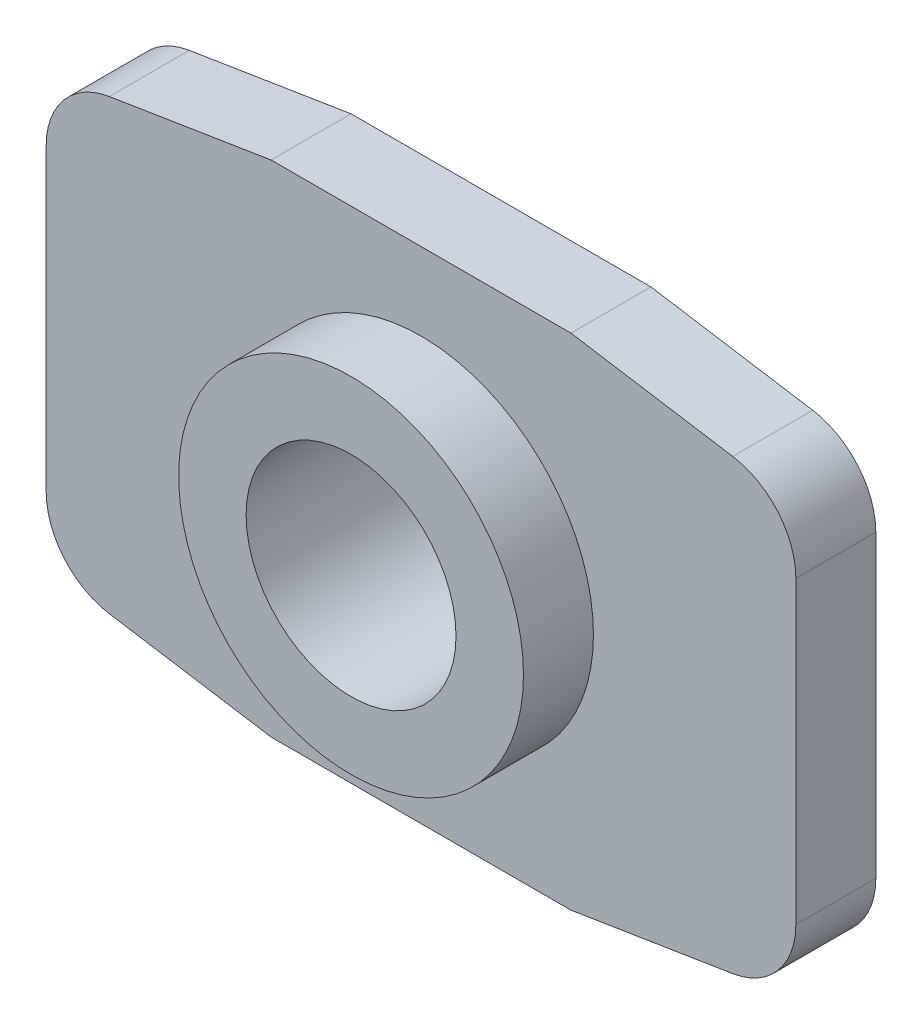
ISO-10303-21;
HEADER;
FILE_DESCRIPTION(('STEP AP214'),'2;1');
FILE_NAME('part.step','',(''),(''),'','','');
FILE_SCHEMA(('AUTOMOTIVE_DESIGN { 1 0 10303 214 1 1 1 1 }'));
ENDSEC;
DATA;
#1=APPLICATION_CONTEXT('core data for automotive mechanical design processes');
#2=APPLICATION_PROTOCOL_DEFINITION('international standard','automotive_design',2000,#1);
#3=PRODUCT_CONTEXT('',#1,'mechanical');
#4=PRODUCT('Part','Part','',(#3));
#5=PRODUCT_RELATED_PRODUCT_CATEGORY('part','',(#4));
#6=PRODUCT_DEFINITION_FORMATION('','',#4);
#7=PRODUCT_DEFINITION_CONTEXT('part definition',#1,'design');
#8=PRODUCT_DEFINITION('design','',#6,#7);
#9=PRODUCT_DEFINITION_SHAPE('','',#8);
#10=(LENGTH_UNIT() NAMED_UNIT(*) SI_UNIT(.MILLI.,.METRE.));
#11=(NAMED_UNIT(*) PLANE_ANGLE_UNIT() SI_UNIT($,.RADIAN.));
#12=(NAMED_UNIT(*) SI_UNIT($,.STERADIAN.) SOLID_ANGLE_UNIT());
#13=UNCERTAINTY_MEASURE_WITH_UNIT(LENGTH_MEASURE(1.E-05),#10,'distance_accuracy_value','');
#14=(GEOMETRIC_REPRESENTATION_CONTEXT(3) GLOBAL_UNCERTAINTY_ASSIGNED_CONTEXT((#13)) GLOBAL_UNIT_ASSIGNED_CONTEXT((#10,
#11,#12)) REPRESENTATION_CONTEXT('',''));
#15=CARTESIAN_POINT('',(0.,0.,0.));
#16=DIRECTION('',(0.,0.,1.));
#17=DIRECTION('',(1.,0.,0.));
#18=AXIS2_PLACEMENT_3D('',#15,#16,#17);
#19=CARTESIAN_POINT('',(5.99999999999999,3.,1.6));
#20=DIRECTION('',(0.,0.,-1.));
#21=DIRECTION('',(-1.,0.,0.));
#22=AXIS2_PLACEMENT_3D('',#19,#20,#21);
#23=CYLINDRICAL_SURFACE('',#22,1.5);
#24=CARTESIAN_POINT('',(5.99999999999999,3.,0.));
#25=DIRECTION('',(0.,0.,1.));
#26=DIRECTION('',(1.,0.,0.));
#27=AXIS2_PLACEMENT_3D('',#24,#25,#26);
#28=CIRCLE('',#27,1.5);
#29=CARTESIAN_POINT('',(7.49999999999999,3.,0.));
#30=VERTEX_POINT('',#29);
#31=CARTESIAN_POINT('',(6.23739675280407,4.48109512920612,0.));
#32=VERTEX_POINT('',#31);
#33=EDGE_CURVE('E179',#30,#32,#28,.T.);
#34=ORIENTED_EDGE('',*,*,#33,.T.);
#35=DIRECTION('',(0.,0.,-1.));
#36=VECTOR('',#35,1.);
#37=CARTESIAN_POINT('',(6.23739675280407,4.48109512920612,1.6));
#38=LINE('',#37,#36);
#39=CARTESIAN_POINT('',(6.23739675280407,4.48109512920612,1.6));
#40=VERTEX_POINT('',#39);
#41=EDGE_CURVE('E54',#40,#32,#38,.T.);
#42=ORIENTED_EDGE('',*,*,#41,.F.);
#43=CARTESIAN_POINT('',(5.99999999999999,3.,1.6));
#44=DIRECTION('',(0.,0.,1.));
#45=DIRECTION('',(1.,0.,0.));
#46=AXIS2_PLACEMENT_3D('',#43,#44,#45);
#47=CIRCLE('',#46,1.5);
#48=CARTESIAN_POINT('',(7.49999999999999,3.,1.6));
#49=VERTEX_POINT('',#48);
#50=EDGE_CURVE('E214',#49,#40,#47,.T.);
#51=ORIENTED_EDGE('',*,*,#50,.F.);
#52=DIRECTION('',(0.,0.,-1.));
#53=VECTOR('',#52,1.);
#54=CARTESIAN_POINT('',(7.49999999999999,3.,1.6));
#55=LINE('',#54,#53);
#56=EDGE_CURVE('E175',#49,#30,#55,.T.);
#57=ORIENTED_EDGE('',*,*,#56,.T.);
#58=EDGE_LOOP('',(#34,#42,#51,#57));
#59=FACE_BOUND('',#58,.T.);
#60=ADVANCED_FACE('F51',(#59),#23,.T.);
#61=CARTESIAN_POINT('',(6.23739675280407,4.48109512920612,1.6));
#62=DIRECTION('',(-0.158264501869385,-0.987396752804077,0.));
#63=DIRECTION('',(0.987396752804077,-0.158264501869385,0.));
#64=AXIS2_PLACEMENT_3D('',#61,#62,#63);
#65=PLANE('',#64);
#66=DIRECTION('',(-0.987396752804077,0.158264501869385,0.));
#67=VECTOR('',#66,1.);
#68=CARTESIAN_POINT('',(6.23739675280407,4.48109512920612,0.));
#69=LINE('',#68,#67);
#70=CARTESIAN_POINT('',(3.00000000000001,5.,0.));
#71=VERTEX_POINT('',#70);
#72=EDGE_CURVE('E183',#32,#71,#69,.T.);
#73=ORIENTED_EDGE('',*,*,#72,.T.);
#74=DIRECTION('',(0.,0.,-1.));
#75=VECTOR('',#74,1.);
#76=CARTESIAN_POINT('',(3.00000000000001,5.,1.6));
#77=LINE('',#76,#75);
#78=CARTESIAN_POINT('',(3.00000000000001,5.,1.6));
#79=VERTEX_POINT('',#78);
#80=EDGE_CURVE('E244',#79,#71,#77,.T.);
#81=ORIENTED_EDGE('',*,*,#80,.F.);
#82=DIRECTION('',(-0.987396752804077,0.158264501869385,0.));
#83=VECTOR('',#82,1.);
#84=CARTESIAN_POINT('',(6.23739675280407,4.48109512920612,1.6));
#85=LINE('',#84,#83);
#86=EDGE_CURVE('E125',#40,#79,#85,.T.);
#87=ORIENTED_EDGE('',*,*,#86,.F.);
#88=ORIENTED_EDGE('',*,*,#41,.T.);
#89=EDGE_LOOP('',(#73,#81,#87,#88));
#90=FACE_BOUND('',#89,.T.);
#91=ADVANCED_FACE('F254',(#90),#65,.F.);
#92=CARTESIAN_POINT('',(3.00000000000001,5.,1.6));
#93=DIRECTION('',(0.,-1.,0.));
#94=DIRECTION('',(0.,0.,-1.));
#95=AXIS2_PLACEMENT_3D('',#92,#93,#94);
#96=PLANE('',#95);
#97=DIRECTION('',(-1.,0.,0.));
#98=VECTOR('',#97,1.);
#99=CARTESIAN_POINT('',(3.00000000000001,5.,0.));
#100=LINE('',#99,#98);
#101=CARTESIAN_POINT('',(-3.00000000000001,5.,0.));
#102=VERTEX_POINT('',#101);
#103=EDGE_CURVE('E187',#71,#102,#100,.T.);
#104=ORIENTED_EDGE('',*,*,#103,.T.);
#105=DIRECTION('',(0.,0.,-1.));
#106=VECTOR('',#105,1.);
#107=CARTESIAN_POINT('',(-3.00000000000001,5.,1.6));
#108=LINE('',#107,#106);
#109=CARTESIAN_POINT('',(-3.00000000000001,5.,1.6));
#110=VERTEX_POINT('',#109);
#111=EDGE_CURVE('E241',#110,#102,#108,.T.);
#112=ORIENTED_EDGE('',*,*,#111,.F.);
#113=DIRECTION('',(-1.,0.,0.));
#114=VECTOR('',#113,1.);
#115=CARTESIAN_POINT('',(3.00000000000001,5.,1.6));
#116=LINE('',#115,#114);
#117=EDGE_CURVE('E272',#79,#110,#116,.T.);
#118=ORIENTED_EDGE('',*,*,#117,.F.);
#119=ORIENTED_EDGE('',*,*,#80,.T.);
#120=EDGE_LOOP('',(#104,#112,#118,#119));
#121=FACE_BOUND('',#120,.T.);
#122=ADVANCED_FACE('F263',(#121),#96,.F.);
#123=CARTESIAN_POINT('',(-3.00000000000001,5.,1.6));
#124=DIRECTION('',(0.158264501869385,-0.987396752804077,0.));
#125=DIRECTION('',(0.987396752804077,0.158264501869385,0.));
#126=AXIS2_PLACEMENT_3D('',#123,#124,#125);
#127=PLANE('',#126);
#128=DIRECTION('',(-0.987396752804077,-0.158264501869385,0.));
#129=VECTOR('',#128,1.);
#130=CARTESIAN_POINT('',(-3.00000000000001,5.,0.));
#131=LINE('',#130,#129);
#132=CARTESIAN_POINT('',(-6.23739675280408,4.48109512920612,0.));
#133=VERTEX_POINT('',#132);
#134=EDGE_CURVE('E190',#102,#133,#131,.T.);
#135=ORIENTED_EDGE('',*,*,#134,.T.);
#136=DIRECTION('',(0.,0.,-1.));
#137=VECTOR('',#136,1.);
#138=CARTESIAN_POINT('',(-6.23739675280408,4.48109512920612,1.6));
#139=LINE('',#138,#137);
#140=CARTESIAN_POINT('',(-6.23739675280408,4.48109512920612,1.6));
#141=VERTEX_POINT('',#140);
#142=EDGE_CURVE('E237',#141,#133,#139,.T.);
#143=ORIENTED_EDGE('',*,*,#142,.F.);
#144=DIRECTION('',(-0.987396752804077,-0.158264501869385,0.));
#145=VECTOR('',#144,1.);
#146=CARTESIAN_POINT('',(-3.00000000000001,5.,1.6));
#147=LINE('',#146,#145);
#148=EDGE_CURVE('E268',#110,#141,#147,.T.);
#149=ORIENTED_EDGE('',*,*,#148,.F.);
#150=ORIENTED_EDGE('',*,*,#111,.T.);
#151=EDGE_LOOP('',(#135,#143,#149,#150));
#152=FACE_BOUND('',#151,.T.);
#153=ADVANCED_FACE('F266',(#152),#127,.F.);
#154=CARTESIAN_POINT('',(-6.,3.,1.6));
#155=DIRECTION('',(0.,0.,-1.));
#156=DIRECTION('',(-1.,0.,0.));
#157=AXIS2_PLACEMENT_3D('',#154,#155,#156);
#158=CYLINDRICAL_SURFACE('',#157,1.5);
#159=CARTESIAN_POINT('',(-6.,3.,0.));
#160=DIRECTION('',(0.,0.,1.));
#161=DIRECTION('',(1.,0.,0.));
#162=AXIS2_PLACEMENT_3D('',#159,#160,#161);
#163=CIRCLE('',#162,1.5);
#164=CARTESIAN_POINT('',(-7.5,3.,0.));
#165=VERTEX_POINT('',#164);
#166=EDGE_CURVE('E193',#133,#165,#163,.T.);
#167=ORIENTED_EDGE('',*,*,#166,.T.);
#168=DIRECTION('',(0.,0.,-1.));
#169=VECTOR('',#168,1.);
#170=CARTESIAN_POINT('',(-7.5,3.,1.6));
#171=LINE('',#170,#169);
#172=CARTESIAN_POINT('',(-7.5,3.,1.6));
#173=VERTEX_POINT('',#172);
#174=EDGE_CURVE('E233',#173,#165,#171,.T.);
#175=ORIENTED_EDGE('',*,*,#174,.F.);
#176=CARTESIAN_POINT('',(-6.,3.,1.6));
#177=DIRECTION('',(0.,0.,1.));
#178=DIRECTION('',(1.,0.,0.));
#179=AXIS2_PLACEMENT_3D('',#176,#177,#178);
#180=CIRCLE('',#179,1.5);
#181=EDGE_CURVE('E271',#141,#173,#180,.T.);
#182=ORIENTED_EDGE('',*,*,#181,.F.);
#183=ORIENTED_EDGE('',*,*,#142,.T.);
#184=EDGE_LOOP('',(#167,#175,#182,#183));
#185=FACE_BOUND('',#184,.T.);
#186=ADVANCED_FACE('F316',(#185),#158,.T.);
#187=CARTESIAN_POINT('',(-7.5,3.,1.6));
#188=DIRECTION('',(1.,0.,0.));
#189=DIRECTION('',(0.,0.,-1.));
#190=AXIS2_PLACEMENT_3D('',#187,#188,#189);
#191=PLANE('',#190);
#192=DIRECTION('',(0.,-1.,0.));
#193=VECTOR('',#192,1.);
#194=CARTESIAN_POINT('',(-7.5,3.,0.));
#195=LINE('',#194,#193);
#196=CARTESIAN_POINT('',(-7.5,-3.,0.));
#197=VERTEX_POINT('',#196);
#198=EDGE_CURVE('E196',#165,#197,#195,.T.);
#199=ORIENTED_EDGE('',*,*,#198,.T.);
#200=DIRECTION('',(0.,0.,-1.));
#201=VECTOR('',#200,1.);
#202=CARTESIAN_POINT('',(-7.5,-3.,1.6));
#203=LINE('',#202,#201);
#204=CARTESIAN_POINT('',(-7.5,-3.,1.6));
#205=VERTEX_POINT('',#204);
#206=EDGE_CURVE('E229',#205,#197,#203,.T.);
#207=ORIENTED_EDGE('',*,*,#206,.F.);
#208=DIRECTION('',(0.,-1.,0.));
#209=VECTOR('',#208,1.);
#210=CARTESIAN_POINT('',(-7.5,3.,1.6));
#211=LINE('',#210,#209);
#212=EDGE_CURVE('E277',#173,#205,#211,.T.);
#213=ORIENTED_EDGE('',*,*,#212,.F.);
#214=ORIENTED_EDGE('',*,*,#174,.T.);
#215=EDGE_LOOP('',(#199,#207,#213,#214));
#216=FACE_BOUND('',#215,.T.);
#217=ADVANCED_FACE('F313',(#216),#191,.F.);
#218=CARTESIAN_POINT('',(-6.,-3.,1.6));
#219=DIRECTION('',(0.,0.,-1.));
#220=DIRECTION('',(-1.,0.,0.));
#221=AXIS2_PLACEMENT_3D('',#218,#219,#220);
#222=CYLINDRICAL_SURFACE('',#221,1.5);
#223=CARTESIAN_POINT('',(-6.,-3.,0.));
#224=DIRECTION('',(0.,0.,1.));
#225=DIRECTION('',(1.,0.,0.));
#226=AXIS2_PLACEMENT_3D('',#223,#224,#225);
#227=CIRCLE('',#226,1.5);
#228=CARTESIAN_POINT('',(-6.23739675280408,-4.48109512920612,0.));
#229=VERTEX_POINT('',#228);
#230=EDGE_CURVE('E199',#197,#229,#227,.T.);
#231=ORIENTED_EDGE('',*,*,#230,.T.);
#232=DIRECTION('',(0.,0.,-1.));
#233=VECTOR('',#232,1.);
#234=CARTESIAN_POINT('',(-6.23739675280408,-4.48109512920612,1.6));
#235=LINE('',#234,#233);
#236=CARTESIAN_POINT('',(-6.23739675280408,-4.48109512920612,1.6));
#237=VERTEX_POINT('',#236);
#238=EDGE_CURVE('E225',#237,#229,#235,.T.);
#239=ORIENTED_EDGE('',*,*,#238,.F.);
#240=CARTESIAN_POINT('',(-6.,-3.,1.6));
#241=DIRECTION('',(0.,0.,1.));
#242=DIRECTION('',(1.,0.,0.));
#243=AXIS2_PLACEMENT_3D('',#240,#241,#242);
#244=CIRCLE('',#243,1.5);
#245=EDGE_CURVE('E284',#205,#237,#244,.T.);
#246=ORIENTED_EDGE('',*,*,#245,.F.);
#247=ORIENTED_EDGE('',*,*,#206,.T.);
#248=EDGE_LOOP('',(#231,#239,#246,#247));
#249=FACE_BOUND('',#248,.T.);
#250=ADVANCED_FACE('F309',(#249),#222,.T.);
#251=CARTESIAN_POINT('',(-6.23739675280408,-4.48109512920612,1.6));
#252=DIRECTION('',(0.158264501869384,0.987396752804077,0.));
#253=DIRECTION('',(-0.987396752804077,0.158264501869384,0.));
#254=AXIS2_PLACEMENT_3D('',#251,#252,#253);
#255=PLANE('',#254);
#256=DIRECTION('',(0.987396752804077,-0.158264501869384,0.));
#257=VECTOR('',#256,1.);
#258=CARTESIAN_POINT('',(-6.23739675280408,-4.48109512920612,0.));
#259=LINE('',#258,#257);
#260=CARTESIAN_POINT('',(-2.99999999999999,-5.,0.));
#261=VERTEX_POINT('',#260);
#262=EDGE_CURVE('E202',#229,#261,#259,.T.);
#263=ORIENTED_EDGE('',*,*,#262,.T.);
#264=DIRECTION('',(0.,0.,-1.));
#265=VECTOR('',#264,1.);
#266=CARTESIAN_POINT('',(-2.99999999999999,-5.,1.6));
#267=LINE('',#266,#265);
#268=CARTESIAN_POINT('',(-2.99999999999999,-5.,1.6));
#269=VERTEX_POINT('',#268);
#270=EDGE_CURVE('E221',#269,#261,#267,.T.);
#271=ORIENTED_EDGE('',*,*,#270,.F.);
#272=DIRECTION('',(0.987396752804077,-0.158264501869384,0.));
#273=VECTOR('',#272,1.);
#274=CARTESIAN_POINT('',(-6.23739675280408,-4.48109512920612,1.6));
#275=LINE('',#274,#273);
#276=EDGE_CURVE('E287',#237,#269,#275,.T.);
#277=ORIENTED_EDGE('',*,*,#276,.F.);
#278=ORIENTED_EDGE('',*,*,#238,.T.);
#279=EDGE_LOOP('',(#263,#271,#277,#278));
#280=FACE_BOUND('',#279,.T.);
#281=ADVANCED_FACE('F301',(#280),#255,.F.);
#282=CARTESIAN_POINT('',(-2.99999999999999,-5.,1.6));
#283=DIRECTION('',(0.,1.,0.));
#284=DIRECTION('',(-1.,0.,0.));
#285=AXIS2_PLACEMENT_3D('',#282,#283,#284);
#286=PLANE('',#285);
#287=DIRECTION('',(1.,0.,0.));
#288=VECTOR('',#287,1.);
#289=CARTESIAN_POINT('',(-2.99999999999999,-5.,0.));
#290=LINE('',#289,#288);
#291=CARTESIAN_POINT('',(3.,-5.,0.));
#292=VERTEX_POINT('',#291);
#293=EDGE_CURVE('E205',#261,#292,#290,.T.);
#294=ORIENTED_EDGE('',*,*,#293,.T.);
#295=DIRECTION('',(0.,0.,-1.));
#296=VECTOR('',#295,1.);
#297=CARTESIAN_POINT('',(3.,-5.,1.6));
#298=LINE('',#297,#296);
#299=CARTESIAN_POINT('',(3.,-5.,1.6));
#300=VERTEX_POINT('',#299);
#301=EDGE_CURVE('E167',#300,#292,#298,.T.);
#302=ORIENTED_EDGE('',*,*,#301,.F.);
#303=DIRECTION('',(1.,0.,0.));
#304=VECTOR('',#303,1.);
#305=CARTESIAN_POINT('',(-2.99999999999999,-5.,1.6));
#306=LINE('',#305,#304);
#307=EDGE_CURVE('E156',#269,#300,#306,.T.);
#308=ORIENTED_EDGE('',*,*,#307,.F.);
#309=ORIENTED_EDGE('',*,*,#270,.T.);
#310=EDGE_LOOP('',(#294,#302,#308,#309));
#311=FACE_BOUND('',#310,.T.);
#312=ADVANCED_FACE('F305',(#311),#286,.F.);
#313=CARTESIAN_POINT('',(3.,-5.,1.6));
#314=DIRECTION('',(-0.158264501869385,0.987396752804077,0.));
#315=DIRECTION('',(-0.987396752804077,-0.158264501869385,0.));
#316=AXIS2_PLACEMENT_3D('',#313,#314,#315);
#317=PLANE('',#316);
#318=DIRECTION('',(0.987396752804077,0.158264501869385,0.));
#319=VECTOR('',#318,1.);
#320=CARTESIAN_POINT('',(3.,-5.,0.));
#321=LINE('',#320,#319);
#322=CARTESIAN_POINT('',(6.23739675280407,-4.48109512920612,0.));
#323=VERTEX_POINT('',#322);
#324=EDGE_CURVE('E165',#292,#323,#321,.T.);
#325=ORIENTED_EDGE('',*,*,#324,.T.);
#326=DIRECTION('',(0.,0.,-1.));
#327=VECTOR('',#326,1.);
#328=CARTESIAN_POINT('',(6.23739675280407,-4.48109512920612,1.6));
#329=LINE('',#328,#327);
#330=CARTESIAN_POINT('',(6.23739675280407,-4.48109512920612,1.6));
#331=VERTEX_POINT('',#330);
#332=EDGE_CURVE('E162',#331,#323,#329,.T.);
#333=ORIENTED_EDGE('',*,*,#332,.F.);
#334=DIRECTION('',(0.987396752804077,0.158264501869385,0.));
#335=VECTOR('',#334,1.);
#336=CARTESIAN_POINT('',(3.,-5.,1.6));
#337=LINE('',#336,#335);
#338=EDGE_CURVE('E150',#300,#331,#337,.T.);
#339=ORIENTED_EDGE('',*,*,#338,.F.);
#340=ORIENTED_EDGE('',*,*,#301,.T.);
#341=EDGE_LOOP('',(#325,#333,#339,#340));
#342=FACE_BOUND('',#341,.T.);
#343=ADVANCED_FACE('F163',(#342),#317,.F.);
#344=CARTESIAN_POINT('',(5.99999999999999,-3.,1.6));
#345=DIRECTION('',(0.,0.,-1.));
#346=DIRECTION('',(-1.,0.,0.));
#347=AXIS2_PLACEMENT_3D('',#344,#345,#346);
#348=CYLINDRICAL_SURFACE('',#347,1.5);
#349=CARTESIAN_POINT('',(5.99999999999999,-3.,0.));
#350=DIRECTION('',(0.,0.,1.));
#351=DIRECTION('',(1.,0.,0.));
#352=AXIS2_PLACEMENT_3D('',#349,#350,#351);
#353=CIRCLE('',#352,1.5);
#354=CARTESIAN_POINT('',(7.49999999999999,-3.,0.));
#355=VERTEX_POINT('',#354);
#356=EDGE_CURVE('E110',#323,#355,#353,.T.);
#357=ORIENTED_EDGE('',*,*,#356,.T.);
#358=DIRECTION('',(0.,0.,-1.));
#359=VECTOR('',#358,1.);
#360=CARTESIAN_POINT('',(7.49999999999999,-3.,1.6));
#361=LINE('',#360,#359);
#362=CARTESIAN_POINT('',(7.49999999999999,-3.,1.6));
#363=VERTEX_POINT('',#362);
#364=EDGE_CURVE('E168',#363,#355,#361,.T.);
#365=ORIENTED_EDGE('',*,*,#364,.F.);
#366=CARTESIAN_POINT('',(5.99999999999999,-3.,1.6));
#367=DIRECTION('',(0.,0.,1.));
#368=DIRECTION('',(1.,0.,0.));
#369=AXIS2_PLACEMENT_3D('',#366,#367,#368);
#370=CIRCLE('',#369,1.5);
#371=EDGE_CURVE('E154',#331,#363,#370,.T.);
#372=ORIENTED_EDGE('',*,*,#371,.F.);
#373=ORIENTED_EDGE('',*,*,#332,.T.);
#374=EDGE_LOOP('',(#357,#365,#372,#373));
#375=FACE_BOUND('',#374,.T.);
#376=ADVANCED_FACE('F170',(#375),#348,.T.);
#377=CARTESIAN_POINT('',(7.49999999999999,-3.,1.6));
#378=DIRECTION('',(-1.,0.,0.));
#379=DIRECTION('',(0.,0.,1.));
#380=AXIS2_PLACEMENT_3D('',#377,#378,#379);
#381=PLANE('',#380);
#382=DIRECTION('',(0.,1.,0.));
#383=VECTOR('',#382,1.);
#384=CARTESIAN_POINT('',(7.49999999999999,-3.,0.));
#385=LINE('',#384,#383);
#386=EDGE_CURVE('E116',#355,#30,#385,.T.);
#387=ORIENTED_EDGE('',*,*,#386,.T.);
#388=ORIENTED_EDGE('',*,*,#56,.F.);
#389=DIRECTION('',(0.,1.,0.));
#390=VECTOR('',#389,1.);
#391=CARTESIAN_POINT('',(7.49999999999999,-3.,1.6));
#392=LINE('',#391,#390);
#393=EDGE_CURVE('E69',#363,#49,#392,.T.);
#394=ORIENTED_EDGE('',*,*,#393,.F.);
#395=ORIENTED_EDGE('',*,*,#364,.T.);
#396=EDGE_LOOP('',(#387,#388,#394,#395));
#397=FACE_BOUND('',#396,.T.);
#398=ADVANCED_FACE('F392',(#397),#381,.F.);
#399=CARTESIAN_POINT('',(5.99999999999999,3.,1.6));
#400=DIRECTION('',(0.,0.,1.));
#401=DIRECTION('',(1.,0.,0.));
#402=AXIS2_PLACEMENT_3D('',#399,#400,#401);
#403=PLANE('',#402);
#404=CARTESIAN_POINT('',(0.,0.,1.6));
#405=DIRECTION('',(0.,0.,1.));
#406=DIRECTION('',(1.,0.,0.));
#407=AXIS2_PLACEMENT_3D('',#404,#405,#406);
#408=CIRCLE('',#407,3.45);
#409=CARTESIAN_POINT('',(3.45,0.,1.6));
#410=VERTEX_POINT('',#409);
#411=EDGE_CURVE('E11',#410,#410,#408,.T.);
#412=ORIENTED_EDGE('',*,*,#411,.F.);
#413=EDGE_LOOP('',(#412));
#414=FACE_BOUND('',#413,.T.);
#415=ORIENTED_EDGE('',*,*,#50,.T.);
#416=ORIENTED_EDGE('',*,*,#86,.T.);
#417=ORIENTED_EDGE('',*,*,#117,.T.);
#418=ORIENTED_EDGE('',*,*,#148,.T.);
#419=ORIENTED_EDGE('',*,*,#181,.T.);
#420=ORIENTED_EDGE('',*,*,#212,.T.);
#421=ORIENTED_EDGE('',*,*,#245,.T.);
#422=ORIENTED_EDGE('',*,*,#276,.T.);
#423=ORIENTED_EDGE('',*,*,#307,.T.);
#424=ORIENTED_EDGE('',*,*,#338,.T.);
#425=ORIENTED_EDGE('',*,*,#371,.T.);
#426=ORIENTED_EDGE('',*,*,#393,.T.);
#427=EDGE_LOOP('',(#415,#416,#417,#418,#419,#420,#421,#422,#423,#424,#425,#426));
#428=FACE_BOUND('',#427,.T.);
#429=ADVANCED_FACE('F152',(#414,#428),#403,.T.);
#430=CARTESIAN_POINT('',(5.99999999999999,3.,0.));
#431=DIRECTION('',(0.,0.,1.));
#432=DIRECTION('',(1.,0.,0.));
#433=AXIS2_PLACEMENT_3D('',#430,#431,#432);
#434=PLANE('',#433);
#435=CARTESIAN_POINT('',(0.,0.,0.));
#436=DIRECTION('',(0.,0.,-1.));
#437=DIRECTION('',(-1.,0.,0.));
#438=AXIS2_PLACEMENT_3D('',#435,#436,#437);
#439=CIRCLE('',#438,2.1);
#440=CARTESIAN_POINT('',(-2.1,0.,0.));
#441=VERTEX_POINT('',#440);
#442=EDGE_CURVE('E466',#441,#441,#439,.T.);
#443=ORIENTED_EDGE('',*,*,#442,.F.);
#444=EDGE_LOOP('',(#443));
#445=FACE_BOUND('',#444,.T.);
#446=ORIENTED_EDGE('',*,*,#33,.F.);
#447=ORIENTED_EDGE('',*,*,#386,.F.);
#448=ORIENTED_EDGE('',*,*,#356,.F.);
#449=ORIENTED_EDGE('',*,*,#324,.F.);
#450=ORIENTED_EDGE('',*,*,#293,.F.);
#451=ORIENTED_EDGE('',*,*,#262,.F.);
#452=ORIENTED_EDGE('',*,*,#230,.F.);
#453=ORIENTED_EDGE('',*,*,#198,.F.);
#454=ORIENTED_EDGE('',*,*,#166,.F.);
#455=ORIENTED_EDGE('',*,*,#134,.F.);
#456=ORIENTED_EDGE('',*,*,#103,.F.);
#457=ORIENTED_EDGE('',*,*,#72,.F.);
#458=EDGE_LOOP('',(#446,#447,#448,#449,#450,#451,#452,#453,#454,#455,#456,#457));
#459=FACE_BOUND('',#458,.T.);
#460=ADVANCED_FACE('F259',(#445,#459),#434,.F.);
#461=CARTESIAN_POINT('',(0.,0.,3.));
#462=DIRECTION('',(0.,0.,-1.));
#463=DIRECTION('',(-1.,0.,0.));
#464=AXIS2_PLACEMENT_3D('',#461,#462,#463);
#465=CYLINDRICAL_SURFACE('',#464,3.45);
#466=CARTESIAN_POINT('',(0.,0.,3.));
#467=DIRECTION('',(0.,0.,1.));
#468=DIRECTION('',(1.,0.,0.));
#469=AXIS2_PLACEMENT_3D('',#466,#467,#468);
#470=CIRCLE('',#469,3.45);
#471=CARTESIAN_POINT('',(3.45,0.,3.));
#472=VERTEX_POINT('',#471);
#473=EDGE_CURVE('E184',#472,#472,#470,.T.);
#474=ORIENTED_EDGE('',*,*,#473,.F.);
#475=EDGE_LOOP('',(#474));
#476=FACE_BOUND('',#475,.T.);
#477=ORIENTED_EDGE('',*,*,#411,.T.);
#478=EDGE_LOOP('',(#477));
#479=FACE_BOUND('',#478,.T.);
#480=ADVANCED_FACE('F420',(#476,#479),#465,.T.);
#481=CARTESIAN_POINT('',(0.,0.,3.));
#482=DIRECTION('',(0.,0.,1.));
#483=DIRECTION('',(1.,0.,0.));
#484=AXIS2_PLACEMENT_3D('',#481,#482,#483);
#485=PLANE('',#484);
#486=CARTESIAN_POINT('',(0.,0.,3.));
#487=DIRECTION('',(0.,0.,1.));
#488=DIRECTION('',(1.,0.,0.));
#489=AXIS2_PLACEMENT_3D('',#486,#487,#488);
#490=CIRCLE('',#489,2.1);
#491=CARTESIAN_POINT('',(2.1,0.,3.));
#492=VERTEX_POINT('',#491);
#493=EDGE_CURVE('E469',#492,#492,#490,.T.);
#494=ORIENTED_EDGE('',*,*,#493,.F.);
#495=EDGE_LOOP('',(#494));
#496=FACE_BOUND('',#495,.T.);
#497=ORIENTED_EDGE('',*,*,#473,.T.);
#498=EDGE_LOOP('',(#497));
#499=FACE_BOUND('',#498,.T.);
#500=ADVANCED_FACE('F430',(#496,#499),#485,.T.);
#501=CARTESIAN_POINT('',(0.,0.,0.));
#502=DIRECTION('',(0.,0.,-1.));
#503=DIRECTION('',(-1.,0.,0.));
#504=AXIS2_PLACEMENT_3D('',#501,#502,#503);
#505=CYLINDRICAL_SURFACE('',#504,2.1);
#506=ORIENTED_EDGE('',*,*,#442,.T.);
#507=EDGE_LOOP('',(#506));
#508=FACE_BOUND('',#507,.T.);
#509=ORIENTED_EDGE('',*,*,#493,.T.);
#510=EDGE_LOOP('',(#509));
#511=FACE_BOUND('',#510,.T.);
#512=ADVANCED_FACE('F439',(#508,#511),#505,.F.);
#513=CLOSED_SHELL('',(#60,#91,#122,#153,#186,#217,#250,#281,#312,#343,#376,#398,#429,#460,#480,
#500,#512));
#514=MANIFOLD_SOLID_BREP('B2',#513);
#515=ADVANCED_BREP_SHAPE_REPRESENTATION('',(#18,#514),#14);
#516=SHAPE_DEFINITION_REPRESENTATION(#9,#515);
ENDSEC;
END-ISO-10303-21;
